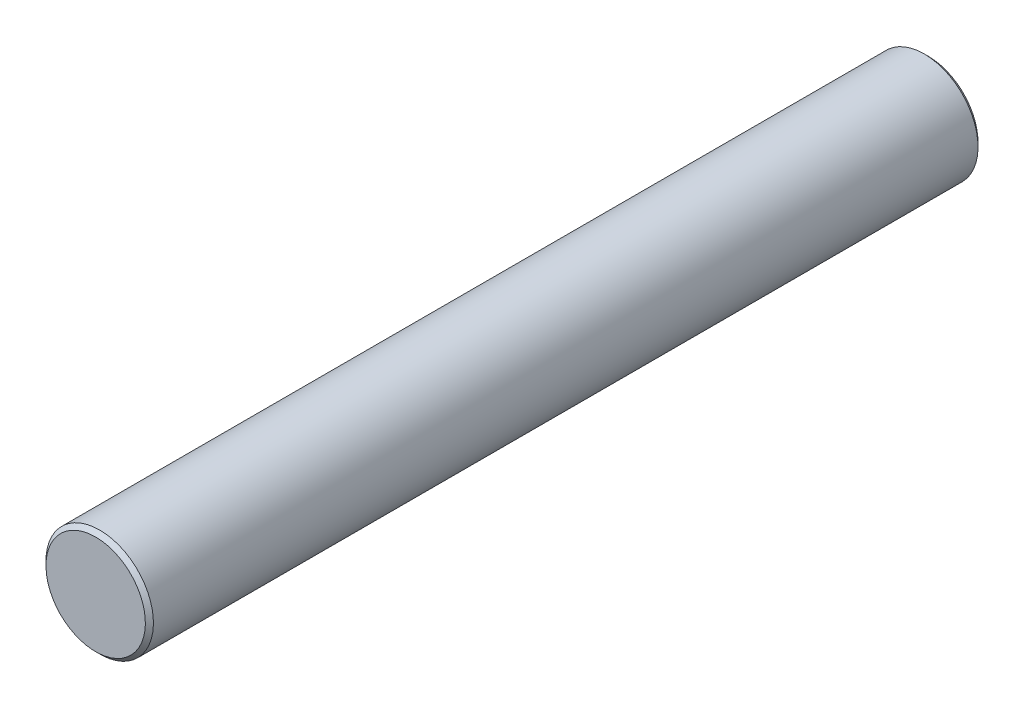
ISO-10303-21;
HEADER;
FILE_DESCRIPTION(('STEP AP214'),'2;1');
FILE_NAME('part.step','',(''),(''),'','','');
FILE_SCHEMA(('AUTOMOTIVE_DESIGN { 1 0 10303 214 1 1 1 1 }'));
ENDSEC;
DATA;
#1=APPLICATION_CONTEXT('core data for automotive mechanical design processes');
#2=APPLICATION_PROTOCOL_DEFINITION('international standard','automotive_design',2000,#1);
#3=PRODUCT_CONTEXT('',#1,'mechanical');
#4=PRODUCT('Part','Part','',(#3));
#5=PRODUCT_RELATED_PRODUCT_CATEGORY('part','',(#4));
#6=PRODUCT_DEFINITION_FORMATION('','',#4);
#7=PRODUCT_DEFINITION_CONTEXT('part definition',#1,'design');
#8=PRODUCT_DEFINITION('design','',#6,#7);
#9=PRODUCT_DEFINITION_SHAPE('','',#8);
#10=(LENGTH_UNIT() NAMED_UNIT(*) SI_UNIT(.MILLI.,.METRE.));
#11=(NAMED_UNIT(*) PLANE_ANGLE_UNIT() SI_UNIT($,.RADIAN.));
#12=(NAMED_UNIT(*) SI_UNIT($,.STERADIAN.) SOLID_ANGLE_UNIT());
#13=UNCERTAINTY_MEASURE_WITH_UNIT(LENGTH_MEASURE(1.E-05),#10,'distance_accuracy_value','');
#14=(GEOMETRIC_REPRESENTATION_CONTEXT(3) GLOBAL_UNCERTAINTY_ASSIGNED_CONTEXT((#13)) GLOBAL_UNIT_ASSIGNED_CONTEXT((#10,
#11,#12)) REPRESENTATION_CONTEXT('',''));
#15=CARTESIAN_POINT('',(0.,0.,0.));
#16=DIRECTION('',(0.,0.,1.));
#17=DIRECTION('',(1.,0.,0.));
#18=AXIS2_PLACEMENT_3D('',#15,#16,#17);
#19=CARTESIAN_POINT('',(0.,9.25,0.));
#20=DIRECTION('',(0.,0.,-1.));
#21=DIRECTION('',(0.,1.,0.));
#22=AXIS2_PLACEMENT_3D('',#19,#20,#21);
#23=PLANE('',#22);
#24=CARTESIAN_POINT('',(0.,0.,0.));
#25=DIRECTION('',(0.,0.,-1.));
#26=DIRECTION('',(0.,1.,0.));
#27=AXIS2_PLACEMENT_3D('',#24,#25,#26);
#28=CIRCLE('',#27,18.5);
#29=CARTESIAN_POINT('',(0.,18.5,0.));
#30=VERTEX_POINT('',#29);
#31=EDGE_CURVE('E9',#30,#30,#28,.T.);
#32=ORIENTED_EDGE('',*,*,#31,.T.);
#33=EDGE_LOOP('',(#32));
#34=FACE_BOUND('',#33,.T.);
#35=CARTESIAN_POINT('',(0.,0.,0.));
#36=DIRECTION('',(0.,0.,1.));
#37=DIRECTION('',(-1.,0.,0.));
#38=AXIS2_PLACEMENT_3D('',#35,#36,#37);
#39=CIRCLE('',#38,6.);
#40=CARTESIAN_POINT('',(-6.,0.,0.));
#41=VERTEX_POINT('',#40);
#42=EDGE_CURVE('E52',#41,#41,#39,.T.);
#43=ORIENTED_EDGE('',*,*,#42,.T.);
#44=EDGE_LOOP('',(#43));
#45=FACE_BOUND('',#44,.T.);
#46=ADVANCED_FACE('F15',(#34,#45),#23,.T.);
#47=CARTESIAN_POINT('',(0.,0.,0.75));
#48=DIRECTION('',(0.,0.,1.));
#49=DIRECTION('',(0.,1.,0.));
#50=AXIS2_PLACEMENT_3D('',#47,#48,#49);
#51=CONICAL_SURFACE('',#50,19.25,0.785398163397448);
#52=CARTESIAN_POINT('',(0.,0.,1.5));
#53=DIRECTION('',(0.,0.,-1.));
#54=DIRECTION('',(0.,1.,0.));
#55=AXIS2_PLACEMENT_3D('',#52,#53,#54);
#56=CIRCLE('',#55,20.);
#57=CARTESIAN_POINT('',(0.,20.,1.5));
#58=VERTEX_POINT('',#57);
#59=EDGE_CURVE('E25',#58,#58,#56,.T.);
#60=ORIENTED_EDGE('',*,*,#59,.T.);
#61=EDGE_LOOP('',(#60));
#62=FACE_BOUND('',#61,.T.);
#63=ORIENTED_EDGE('',*,*,#31,.F.);
#64=EDGE_LOOP('',(#63));
#65=FACE_BOUND('',#64,.T.);
#66=ADVANCED_FACE('F121',(#62,#65),#51,.T.);
#67=CARTESIAN_POINT('',(0.,0.,155.));
#68=DIRECTION('',(0.,0.,1.));
#69=DIRECTION('',(0.,1.,0.));
#70=AXIS2_PLACEMENT_3D('',#67,#68,#69);
#71=CYLINDRICAL_SURFACE('',#70,20.);
#72=CARTESIAN_POINT('',(0.,0.,308.5));
#73=DIRECTION('',(0.,0.,-1.));
#74=DIRECTION('',(0.,1.,0.));
#75=AXIS2_PLACEMENT_3D('',#72,#73,#74);
#76=CIRCLE('',#75,20.);
#77=CARTESIAN_POINT('',(0.,20.,308.5));
#78=VERTEX_POINT('',#77);
#79=EDGE_CURVE('E19',#78,#78,#76,.T.);
#80=ORIENTED_EDGE('',*,*,#79,.T.);
#81=EDGE_LOOP('',(#80));
#82=FACE_BOUND('',#81,.T.);
#83=ORIENTED_EDGE('',*,*,#59,.F.);
#84=EDGE_LOOP('',(#83));
#85=FACE_BOUND('',#84,.T.);
#86=CARTESIAN_POINT('',(0.,0.,6.5));
#87=DIRECTION('',(0.,0.,-1.));
#88=DIRECTION('',(0.,1.,0.));
#89=AXIS2_PLACEMENT_3D('',#86,#87,#88);
#90=CIRCLE('',#89,20.);
#91=CARTESIAN_POINT('',(10.5356537528527,-17.,6.5));
#92=VERTEX_POINT('',#91);
#93=CARTESIAN_POINT('',(-10.5356537528527,-17.,6.5));
#94=VERTEX_POINT('',#93);
#95=EDGE_CURVE('E69',#92,#94,#90,.T.);
#96=ORIENTED_EDGE('',*,*,#95,.T.);
#97=DIRECTION('',(0.,0.,1.));
#98=VECTOR('',#97,1.);
#99=CARTESIAN_POINT('',(-10.5356537528527,-17.,8.25));
#100=LINE('',#99,#98);
#101=CARTESIAN_POINT('',(-10.5356537528527,-17.,10.));
#102=VERTEX_POINT('',#101);
#103=EDGE_CURVE('E62',#94,#102,#100,.T.);
#104=ORIENTED_EDGE('',*,*,#103,.T.);
#105=CARTESIAN_POINT('',(0.,0.,10.));
#106=DIRECTION('',(0.,0.,1.));
#107=DIRECTION('',(0.,1.,0.));
#108=AXIS2_PLACEMENT_3D('',#105,#106,#107);
#109=CIRCLE('',#108,20.);
#110=CARTESIAN_POINT('',(10.5356537528527,-17.,10.));
#111=VERTEX_POINT('',#110);
#112=EDGE_CURVE('E75',#102,#111,#109,.T.);
#113=ORIENTED_EDGE('',*,*,#112,.T.);
#114=DIRECTION('',(0.,0.,-1.));
#115=VECTOR('',#114,1.);
#116=CARTESIAN_POINT('',(10.5356537528527,-17.,8.25));
#117=LINE('',#116,#115);
#118=EDGE_CURVE('E60',#111,#92,#117,.T.);
#119=ORIENTED_EDGE('',*,*,#118,.T.);
#120=EDGE_LOOP('',(#96,#104,#113,#119));
#121=FACE_BOUND('',#120,.T.);
#122=ADVANCED_FACE('F17',(#82,#85,#121),#71,.T.);
#123=CARTESIAN_POINT('',(0.,0.,309.25));
#124=DIRECTION('',(0.,0.,-1.));
#125=DIRECTION('',(0.,1.,0.));
#126=AXIS2_PLACEMENT_3D('',#123,#124,#125);
#127=CONICAL_SURFACE('',#126,19.25,0.785398163397448);
#128=CARTESIAN_POINT('',(0.,0.,310.));
#129=DIRECTION('',(0.,0.,-1.));
#130=DIRECTION('',(0.,1.,0.));
#131=AXIS2_PLACEMENT_3D('',#128,#129,#130);
#132=CIRCLE('',#131,18.5);
#133=CARTESIAN_POINT('',(0.,18.5,310.));
#134=VERTEX_POINT('',#133);
#135=EDGE_CURVE('E44',#134,#134,#132,.T.);
#136=ORIENTED_EDGE('',*,*,#135,.T.);
#137=EDGE_LOOP('',(#136));
#138=FACE_BOUND('',#137,.T.);
#139=ORIENTED_EDGE('',*,*,#79,.F.);
#140=EDGE_LOOP('',(#139));
#141=FACE_BOUND('',#140,.T.);
#142=ADVANCED_FACE('F116',(#138,#141),#127,.T.);
#143=CARTESIAN_POINT('',(0.,9.25,310.));
#144=DIRECTION('',(0.,0.,1.));
#145=DIRECTION('',(0.,-1.,0.));
#146=AXIS2_PLACEMENT_3D('',#143,#144,#145);
#147=PLANE('',#146);
#148=ORIENTED_EDGE('',*,*,#135,.F.);
#149=EDGE_LOOP('',(#148));
#150=FACE_BOUND('',#149,.T.);
#151=ADVANCED_FACE('F110',(#150),#147,.T.);
#152=CARTESIAN_POINT('',(0.,0.,26.4586213285198));
#153=DIRECTION('',(0.,0.,-1.));
#154=DIRECTION('',(-1.,0.,0.));
#155=AXIS2_PLACEMENT_3D('',#152,#153,#154);
#156=CONICAL_SURFACE('',#155,2.52640625,1.0471975511966);
#157=CARTESIAN_POINT('',(0.,0.,25.));
#158=DIRECTION('',(0.,0.,1.));
#159=DIRECTION('',(-1.,0.,0.));
#160=AXIS2_PLACEMENT_3D('',#157,#158,#159);
#161=CIRCLE('',#160,5.0528125);
#162=CARTESIAN_POINT('',(-5.0528125,0.,25.));
#163=VERTEX_POINT('',#162);
#164=EDGE_CURVE('E51',#163,#163,#161,.T.);
#165=ORIENTED_EDGE('',*,*,#164,.F.);
#166=EDGE_LOOP('',(#165));
#167=FACE_BOUND('',#166,.T.);
#168=CARTESIAN_POINT('',(0.,0.,27.9172426570397));
#169=VERTEX_POINT('',#168);
#170=VERTEX_LOOP('',#169);
#171=FACE_BOUND('',#170,.T.);
#172=ADVANCED_FACE('F104',(#167,#171),#156,.F.);
#173=CARTESIAN_POINT('',(0.,0.,12.97359375));
#174=DIRECTION('',(0.,0.,-1.));
#175=DIRECTION('',(-1.,0.,0.));
#176=AXIS2_PLACEMENT_3D('',#173,#174,#175);
#177=CYLINDRICAL_SURFACE('',#176,5.0528125);
#178=CARTESIAN_POINT('',(0.,0.,0.9471875));
#179=DIRECTION('',(0.,0.,1.));
#180=DIRECTION('',(-1.,0.,0.));
#181=AXIS2_PLACEMENT_3D('',#178,#179,#180);
#182=CIRCLE('',#181,5.0528125);
#183=CARTESIAN_POINT('',(-5.0528125,0.,0.9471875));
#184=VERTEX_POINT('',#183);
#185=EDGE_CURVE('E57',#184,#184,#182,.T.);
#186=ORIENTED_EDGE('',*,*,#185,.F.);
#187=EDGE_LOOP('',(#186));
#188=FACE_BOUND('',#187,.T.);
#189=ORIENTED_EDGE('',*,*,#164,.T.);
#190=EDGE_LOOP('',(#189));
#191=FACE_BOUND('',#190,.T.);
#192=ADVANCED_FACE('F101',(#188,#191),#177,.F.);
#193=CARTESIAN_POINT('',(0.,0.,0.47359375));
#194=DIRECTION('',(0.,0.,-1.));
#195=DIRECTION('',(-1.,0.,0.));
#196=AXIS2_PLACEMENT_3D('',#193,#194,#195);
#197=CONICAL_SURFACE('',#196,5.52640625,0.785398163397448);
#198=ORIENTED_EDGE('',*,*,#42,.F.);
#199=EDGE_LOOP('',(#198));
#200=FACE_BOUND('',#199,.T.);
#201=ORIENTED_EDGE('',*,*,#185,.T.);
#202=EDGE_LOOP('',(#201));
#203=FACE_BOUND('',#202,.T.);
#204=ADVANCED_FACE('F99',(#200,#203),#197,.F.);
#205=CARTESIAN_POINT('',(0.,-17.,8.25));
#206=DIRECTION('',(0.,-1.,0.));
#207=DIRECTION('',(0.,0.,-1.));
#208=AXIS2_PLACEMENT_3D('',#205,#206,#207);
#209=PLANE('',#208);
#210=ORIENTED_EDGE('',*,*,#103,.F.);
#211=DIRECTION('',(1.,0.,0.));
#212=VECTOR('',#211,1.);
#213=CARTESIAN_POINT('',(0.,-17.,6.5));
#214=LINE('',#213,#212);
#215=EDGE_CURVE('E66',#94,#92,#214,.T.);
#216=ORIENTED_EDGE('',*,*,#215,.T.);
#217=ORIENTED_EDGE('',*,*,#118,.F.);
#218=DIRECTION('',(-1.,0.,0.));
#219=VECTOR('',#218,1.);
#220=CARTESIAN_POINT('',(0.,-17.,10.));
#221=LINE('',#220,#219);
#222=EDGE_CURVE('E72',#111,#102,#221,.T.);
#223=ORIENTED_EDGE('',*,*,#222,.T.);
#224=EDGE_LOOP('',(#210,#216,#217,#223));
#225=FACE_BOUND('',#224,.T.);
#226=ADVANCED_FACE('F131',(#225),#209,.T.);
#227=CARTESIAN_POINT('',(0.,-19.5,6.5));
#228=DIRECTION('',(0.,0.,1.));
#229=DIRECTION('',(1.,0.,0.));
#230=AXIS2_PLACEMENT_3D('',#227,#228,#229);
#231=PLANE('',#230);
#232=ORIENTED_EDGE('',*,*,#95,.F.);
#233=ORIENTED_EDGE('',*,*,#215,.F.);
#234=EDGE_LOOP('',(#232,#233));
#235=FACE_BOUND('',#234,.T.);
#236=ADVANCED_FACE('F135',(#235),#231,.T.);
#237=CARTESIAN_POINT('',(0.,-19.5,10.));
#238=DIRECTION('',(0.,0.,1.));
#239=DIRECTION('',(1.,0.,0.));
#240=AXIS2_PLACEMENT_3D('',#237,#238,#239);
#241=PLANE('',#240);
#242=ORIENTED_EDGE('',*,*,#112,.F.);
#243=ORIENTED_EDGE('',*,*,#222,.F.);
#244=EDGE_LOOP('',(#242,#243));
#245=FACE_BOUND('',#244,.T.);
#246=ADVANCED_FACE('F87',(#245),#241,.F.);
#247=CLOSED_SHELL('',(#46,#66,#122,#142,#151,#172,#192,#204,#226,#236,#246));
#248=MANIFOLD_SOLID_BREP('B1',#247);
#249=ADVANCED_BREP_SHAPE_REPRESENTATION('',(#18,#248),#14);
#250=SHAPE_DEFINITION_REPRESENTATION(#9,#249);
ENDSEC;
END-ISO-10303-21;
